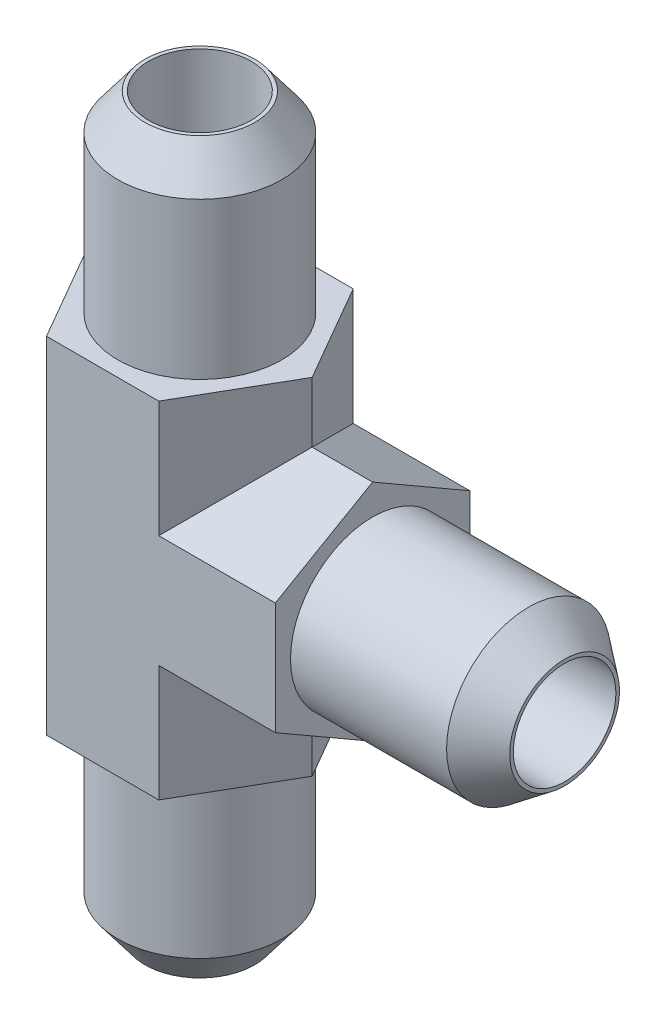
ISO-10303-21;
HEADER;
FILE_DESCRIPTION(('STEP AP214'),'2;1');
FILE_NAME('part.step','',(''),(''),'','','');
FILE_SCHEMA(('AUTOMOTIVE_DESIGN { 1 0 10303 214 1 1 1 1 }'));
ENDSEC;
DATA;
#1=APPLICATION_CONTEXT('core data for automotive mechanical design processes');
#2=APPLICATION_PROTOCOL_DEFINITION('international standard','automotive_design',2000,#1);
#3=PRODUCT_CONTEXT('',#1,'mechanical');
#4=PRODUCT('Part','Part','',(#3));
#5=PRODUCT_RELATED_PRODUCT_CATEGORY('part','',(#4));
#6=PRODUCT_DEFINITION_FORMATION('','',#4);
#7=PRODUCT_DEFINITION_CONTEXT('part definition',#1,'design');
#8=PRODUCT_DEFINITION('design','',#6,#7);
#9=PRODUCT_DEFINITION_SHAPE('','',#8);
#10=(LENGTH_UNIT() NAMED_UNIT(*) SI_UNIT(.MILLI.,.METRE.));
#11=(NAMED_UNIT(*) PLANE_ANGLE_UNIT() SI_UNIT($,.RADIAN.));
#12=(NAMED_UNIT(*) SI_UNIT($,.STERADIAN.) SOLID_ANGLE_UNIT());
#13=UNCERTAINTY_MEASURE_WITH_UNIT(LENGTH_MEASURE(1.E-05),#10,'distance_accuracy_value','');
#14=(GEOMETRIC_REPRESENTATION_CONTEXT(3) GLOBAL_UNCERTAINTY_ASSIGNED_CONTEXT((#13)) GLOBAL_UNIT_ASSIGNED_CONTEXT((#10,
#11,#12)) REPRESENTATION_CONTEXT('',''));
#15=CARTESIAN_POINT('',(0.,0.,0.));
#16=DIRECTION('',(0.,0.,1.));
#17=DIRECTION('',(1.,0.,0.));
#18=AXIS2_PLACEMENT_3D('',#15,#16,#17);
#19=CARTESIAN_POINT('',(0.,-26.8224,0.));
#20=DIRECTION('',(0.,1.,0.));
#21=DIRECTION('',(0.,0.,1.));
#22=AXIS2_PLACEMENT_3D('',#19,#20,#21);
#23=CYLINDRICAL_SURFACE('',#22,6.0325);
#24=CARTESIAN_POINT('',(0.,-12.7,0.));
#25=DIRECTION('',(0.,-1.,0.));
#26=DIRECTION('',(0.,0.,-1.));
#27=AXIS2_PLACEMENT_3D('',#24,#25,#26);
#28=CIRCLE('',#27,6.0325);
#29=CARTESIAN_POINT('',(0.,-12.7,-6.0325));
#30=VERTEX_POINT('',#29);
#31=EDGE_CURVE('E11',#30,#30,#28,.T.);
#32=ORIENTED_EDGE('',*,*,#31,.T.);
#33=EDGE_LOOP('',(#32));
#34=FACE_BOUND('',#33,.T.);
#35=CARTESIAN_POINT('',(0.,-24.1764053301711,0.));
#36=DIRECTION('',(0.,1.,0.));
#37=DIRECTION('',(0.,0.,1.));
#38=AXIS2_PLACEMENT_3D('',#35,#36,#37);
#39=CIRCLE('',#38,6.0325);
#40=CARTESIAN_POINT('',(0.,-24.1764053301711,6.0325));
#41=VERTEX_POINT('',#40);
#42=EDGE_CURVE('E160',#41,#41,#39,.F.);
#43=ORIENTED_EDGE('',*,*,#42,.F.);
#44=EDGE_LOOP('',(#43));
#45=FACE_BOUND('',#44,.T.);
#46=ADVANCED_FACE('F36',(#34,#45),#23,.T.);
#47=CARTESIAN_POINT('',(26.8224,0.,0.));
#48=DIRECTION('',(-1.,0.,0.));
#49=DIRECTION('',(0.,0.,1.));
#50=AXIS2_PLACEMENT_3D('',#47,#48,#49);
#51=CYLINDRICAL_SURFACE('',#50,6.0325);
#52=CARTESIAN_POINT('',(12.7,0.,0.));
#53=DIRECTION('',(1.,0.,0.));
#54=DIRECTION('',(0.,0.,-1.));
#55=AXIS2_PLACEMENT_3D('',#52,#53,#54);
#56=CIRCLE('',#55,6.0325);
#57=CARTESIAN_POINT('',(12.7,0.,-6.0325));
#58=VERTEX_POINT('',#57);
#59=EDGE_CURVE('E45',#58,#58,#56,.T.);
#60=ORIENTED_EDGE('',*,*,#59,.T.);
#61=EDGE_LOOP('',(#60));
#62=FACE_BOUND('',#61,.T.);
#63=CARTESIAN_POINT('',(24.1764053301711,0.,0.));
#64=DIRECTION('',(-1.,0.,0.));
#65=DIRECTION('',(0.,0.,1.));
#66=AXIS2_PLACEMENT_3D('',#63,#64,#65);
#67=CIRCLE('',#66,6.0325);
#68=CARTESIAN_POINT('',(24.1764053301711,0.,6.0325));
#69=VERTEX_POINT('',#68);
#70=EDGE_CURVE('E166',#69,#69,#67,.F.);
#71=ORIENTED_EDGE('',*,*,#70,.F.);
#72=EDGE_LOOP('',(#71));
#73=FACE_BOUND('',#72,.T.);
#74=ADVANCED_FACE('F314',(#62,#73),#51,.T.);
#75=CARTESIAN_POINT('',(4.12811215973278,12.7,7.15009999999998));
#76=DIRECTION('',(-0.866025403784442,0.,-0.499999999999995));
#77=DIRECTION('',(-0.499999999999995,0.,0.866025403784442));
#78=AXIS2_PLACEMENT_3D('',#75,#76,#77);
#79=PLANE('',#78);
#80=DIRECTION('',(-0.447213595499953,-0.447213595499959,0.774596669241486));
#81=VECTOR('',#80,1.);
#82=CARTESIAN_POINT('',(5.84248972778622,5.8424897277862,4.18071094877502));
#83=LINE('',#82,#81);
#84=CARTESIAN_POINT('',(8.25622431946552,8.25622431946547,0.));
#85=VERTEX_POINT('',#84);
#86=CARTESIAN_POINT('',(4.12811215973278,4.12811215973273,7.15009999999998));
#87=VERTEX_POINT('',#86);
#88=EDGE_CURVE('E40',#85,#87,#83,.T.);
#89=ORIENTED_EDGE('',*,*,#88,.F.);
#90=DIRECTION('',(0.,-1.,0.));
#91=VECTOR('',#90,1.);
#92=CARTESIAN_POINT('',(8.25622431946549,12.7,0.));
#93=LINE('',#92,#91);
#94=CARTESIAN_POINT('',(8.25622431946549,12.7,0.));
#95=VERTEX_POINT('',#94);
#96=EDGE_CURVE('E239',#95,#85,#93,.T.);
#97=ORIENTED_EDGE('',*,*,#96,.F.);
#98=DIRECTION('',(0.499999999999995,0.,-0.866025403784442));
#99=VECTOR('',#98,1.);
#100=CARTESIAN_POINT('',(4.12811215973278,12.7,7.15009999999998));
#101=LINE('',#100,#99);
#102=CARTESIAN_POINT('',(4.12811215973278,12.7,7.15009999999998));
#103=VERTEX_POINT('',#102);
#104=EDGE_CURVE('E211',#103,#95,#101,.T.);
#105=ORIENTED_EDGE('',*,*,#104,.F.);
#106=DIRECTION('',(0.,-1.,0.));
#107=VECTOR('',#106,1.);
#108=CARTESIAN_POINT('',(4.12811215973278,12.7,7.15009999999998));
#109=LINE('',#108,#107);
#110=EDGE_CURVE('E243',#103,#87,#109,.T.);
#111=ORIENTED_EDGE('',*,*,#110,.T.);
#112=EDGE_LOOP('',(#89,#97,#105,#111));
#113=FACE_BOUND('',#112,.T.);
#114=ADVANCED_FACE('F270',(#113),#79,.F.);
#115=DIRECTION('',(0.447213595499953,-0.447213595499959,-0.774596669241485));
#116=VECTOR('',#115,1.);
#117=CARTESIAN_POINT('',(0.762489727786258,-0.762489727786166,12.979529051225));
#118=LINE('',#117,#116);
#119=CARTESIAN_POINT('',(4.12811215973278,-4.12811215973273,7.15009999999998));
#120=VERTEX_POINT('',#119);
#121=CARTESIAN_POINT('',(8.25622431946552,-8.25622431946546,0.));
#122=VERTEX_POINT('',#121);
#123=EDGE_CURVE('E251',#120,#122,#118,.T.);
#124=ORIENTED_EDGE('',*,*,#123,.F.);
#125=CARTESIAN_POINT('',(4.12811215973278,-12.7,7.15009999999998));
#126=VERTEX_POINT('',#125);
#127=EDGE_CURVE('E242',#120,#126,#109,.T.);
#128=ORIENTED_EDGE('',*,*,#127,.T.);
#129=DIRECTION('',(0.499999999999995,0.,-0.866025403784442));
#130=VECTOR('',#129,1.);
#131=CARTESIAN_POINT('',(4.12811215973278,-12.7,7.15009999999998));
#132=LINE('',#131,#130);
#133=CARTESIAN_POINT('',(8.25622431946549,-12.7,0.));
#134=VERTEX_POINT('',#133);
#135=EDGE_CURVE('E225',#126,#134,#132,.T.);
#136=ORIENTED_EDGE('',*,*,#135,.T.);
#137=EDGE_CURVE('E238',#122,#134,#93,.T.);
#138=ORIENTED_EDGE('',*,*,#137,.F.);
#139=EDGE_LOOP('',(#124,#128,#136,#138));
#140=FACE_BOUND('',#139,.T.);
#141=ADVANCED_FACE('F286',(#140),#79,.F.);
#142=CARTESIAN_POINT('',(8.25622431946549,12.7,0.));
#143=DIRECTION('',(-0.866025403784435,0.,0.500000000000007));
#144=DIRECTION('',(0.500000000000007,0.,0.866025403784435));
#145=AXIS2_PLACEMENT_3D('',#142,#143,#144);
#146=PLANE('',#145);
#147=DIRECTION('',(0.447213595499965,0.447213595499956,0.77459666924148));
#148=VECTOR('',#147,1.);
#149=CARTESIAN_POINT('',(9.14497945557241,9.14497945557234,1.5393690512249));
#150=LINE('',#149,#148);
#151=CARTESIAN_POINT('',(4.12811215973268,4.12811215973274,-7.15009999999998));
#152=VERTEX_POINT('',#151);
#153=EDGE_CURVE('E200',#152,#85,#150,.T.);
#154=ORIENTED_EDGE('',*,*,#153,.F.);
#155=DIRECTION('',(0.,-1.,0.));
#156=VECTOR('',#155,1.);
#157=CARTESIAN_POINT('',(4.12811215973268,12.7,-7.15010000000004));
#158=LINE('',#157,#156);
#159=CARTESIAN_POINT('',(4.12811215973268,12.7,-7.15010000000004));
#160=VERTEX_POINT('',#159);
#161=EDGE_CURVE('E235',#160,#152,#158,.T.);
#162=ORIENTED_EDGE('',*,*,#161,.F.);
#163=DIRECTION('',(-0.500000000000007,0.,-0.866025403784435));
#164=VECTOR('',#163,1.);
#165=CARTESIAN_POINT('',(8.25622431946549,12.7,0.));
#166=LINE('',#165,#164);
#167=EDGE_CURVE('E213',#95,#160,#166,.T.);
#168=ORIENTED_EDGE('',*,*,#167,.F.);
#169=ORIENTED_EDGE('',*,*,#96,.T.);
#170=EDGE_LOOP('',(#154,#162,#168,#169));
#171=FACE_BOUND('',#170,.T.);
#172=ADVANCED_FACE('F298',(#171),#146,.F.);
#173=DIRECTION('',(-0.447213595499965,0.447213595499956,-0.774596669241481));
#174=VECTOR('',#173,1.);
#175=CARTESIAN_POINT('',(4.06497945557236,-4.06497945557238,-7.25944905122493));
#176=LINE('',#175,#174);
#177=CARTESIAN_POINT('',(4.12811215973268,-4.12811215973271,-7.15010000000004));
#178=VERTEX_POINT('',#177);
#179=EDGE_CURVE('E198',#122,#178,#176,.T.);
#180=ORIENTED_EDGE('',*,*,#179,.F.);
#181=ORIENTED_EDGE('',*,*,#137,.T.);
#182=DIRECTION('',(-0.500000000000007,0.,-0.866025403784435));
#183=VECTOR('',#182,1.);
#184=CARTESIAN_POINT('',(8.25622431946549,-12.7,0.));
#185=LINE('',#184,#183);
#186=CARTESIAN_POINT('',(4.12811215973268,-12.7,-7.15010000000004));
#187=VERTEX_POINT('',#186);
#188=EDGE_CURVE('E228',#134,#187,#185,.T.);
#189=ORIENTED_EDGE('',*,*,#188,.T.);
#190=EDGE_CURVE('E234',#178,#187,#158,.T.);
#191=ORIENTED_EDGE('',*,*,#190,.F.);
#192=EDGE_LOOP('',(#180,#181,#189,#191));
#193=FACE_BOUND('',#192,.T.);
#194=ADVANCED_FACE('F312',(#193),#146,.F.);
#195=CARTESIAN_POINT('',(-4.12811215973283,12.7,-7.15009999999995));
#196=DIRECTION('',(0.866025403784442,0.,0.499999999999995));
#197=DIRECTION('',(0.499999999999995,0.,-0.866025403784442));
#198=AXIS2_PLACEMENT_3D('',#195,#196,#197);
#199=PLANE('',#198);
#200=DIRECTION('',(-0.499999999999995,0.,0.866025403784442));
#201=VECTOR('',#200,1.);
#202=CARTESIAN_POINT('',(-4.12811215973283,-12.7,-7.15009999999995));
#203=LINE('',#202,#201);
#204=CARTESIAN_POINT('',(-4.12811215973283,-12.7,-7.15009999999995));
#205=VERTEX_POINT('',#204);
#206=CARTESIAN_POINT('',(-8.25622431946549,-12.7,0.));
#207=VERTEX_POINT('',#206);
#208=EDGE_CURVE('E202',#205,#207,#203,.T.);
#209=ORIENTED_EDGE('',*,*,#208,.T.);
#210=DIRECTION('',(0.,-1.,0.));
#211=VECTOR('',#210,1.);
#212=CARTESIAN_POINT('',(-8.25622431946549,12.7,0.));
#213=LINE('',#212,#211);
#214=CARTESIAN_POINT('',(-8.25622431946549,12.7,0.));
#215=VERTEX_POINT('',#214);
#216=EDGE_CURVE('E249',#215,#207,#213,.T.);
#217=ORIENTED_EDGE('',*,*,#216,.F.);
#218=DIRECTION('',(-0.499999999999995,0.,0.866025403784442));
#219=VECTOR('',#218,1.);
#220=CARTESIAN_POINT('',(-4.12811215973283,12.7,-7.15009999999995));
#221=LINE('',#220,#219);
#222=CARTESIAN_POINT('',(-4.12811215973283,12.7,-7.15009999999995));
#223=VERTEX_POINT('',#222);
#224=EDGE_CURVE('E203',#223,#215,#221,.T.);
#225=ORIENTED_EDGE('',*,*,#224,.F.);
#226=DIRECTION('',(0.,-1.,0.));
#227=VECTOR('',#226,1.);
#228=CARTESIAN_POINT('',(-4.12811215973283,12.7,-7.15009999999995));
#229=LINE('',#228,#227);
#230=EDGE_CURVE('E217',#223,#205,#229,.T.);
#231=ORIENTED_EDGE('',*,*,#230,.T.);
#232=EDGE_LOOP('',(#209,#217,#225,#231));
#233=FACE_BOUND('',#232,.T.);
#234=ADVANCED_FACE('F38',(#233),#199,.F.);
#235=CARTESIAN_POINT('',(-8.25622431946549,12.7,0.));
#236=DIRECTION('',(0.866025403784438,0.,-0.500000000000001));
#237=DIRECTION('',(-0.500000000000001,0.,-0.866025403784438));
#238=AXIS2_PLACEMENT_3D('',#235,#236,#237);
#239=PLANE('',#238);
#240=DIRECTION('',(0.500000000000001,0.,0.866025403784438));
#241=VECTOR('',#240,1.);
#242=CARTESIAN_POINT('',(-8.25622431946549,-12.7,0.));
#243=LINE('',#242,#241);
#244=CARTESIAN_POINT('',(-4.12811215973273,-12.7,7.15010000000001));
#245=VERTEX_POINT('',#244);
#246=EDGE_CURVE('E220',#207,#245,#243,.T.);
#247=ORIENTED_EDGE('',*,*,#246,.T.);
#248=DIRECTION('',(0.,-1.,0.));
#249=VECTOR('',#248,1.);
#250=CARTESIAN_POINT('',(-4.12811215973273,12.7,7.15010000000001));
#251=LINE('',#250,#249);
#252=CARTESIAN_POINT('',(-4.12811215973273,12.7,7.15010000000001));
#253=VERTEX_POINT('',#252);
#254=EDGE_CURVE('E246',#253,#245,#251,.T.);
#255=ORIENTED_EDGE('',*,*,#254,.F.);
#256=DIRECTION('',(0.500000000000001,0.,0.866025403784438));
#257=VECTOR('',#256,1.);
#258=CARTESIAN_POINT('',(-8.25622431946549,12.7,0.));
#259=LINE('',#258,#257);
#260=EDGE_CURVE('E206',#215,#253,#259,.T.);
#261=ORIENTED_EDGE('',*,*,#260,.F.);
#262=ORIENTED_EDGE('',*,*,#216,.T.);
#263=EDGE_LOOP('',(#247,#255,#261,#262));
#264=FACE_BOUND('',#263,.T.);
#265=ADVANCED_FACE('F305',(#264),#239,.F.);
#266=CARTESIAN_POINT('',(-4.12811215973273,12.7,7.15010000000001));
#267=DIRECTION('',(0.,0.,-1.));
#268=DIRECTION('',(-1.,0.,0.));
#269=AXIS2_PLACEMENT_3D('',#266,#267,#268);
#270=PLANE('',#269);
#271=ORIENTED_EDGE('',*,*,#127,.F.);
#272=DIRECTION('',(-1.,0.,0.));
#273=VECTOR('',#272,1.);
#274=CARTESIAN_POINT('',(12.7,-4.12811215973273,7.15009999999998));
#275=LINE('',#274,#273);
#276=CARTESIAN_POINT('',(12.7,-4.12811215973273,7.15009999999998));
#277=VERTEX_POINT('',#276);
#278=EDGE_CURVE('E190',#277,#120,#275,.T.);
#279=ORIENTED_EDGE('',*,*,#278,.F.);
#280=DIRECTION('',(0.,-1.,0.));
#281=VECTOR('',#280,1.);
#282=CARTESIAN_POINT('',(12.7,4.12811215973273,7.15009999999998));
#283=LINE('',#282,#281);
#284=CARTESIAN_POINT('',(12.7,4.12811215973273,7.15009999999998));
#285=VERTEX_POINT('',#284);
#286=EDGE_CURVE('E176',#285,#277,#283,.T.);
#287=ORIENTED_EDGE('',*,*,#286,.F.);
#288=DIRECTION('',(-1.,0.,0.));
#289=VECTOR('',#288,1.);
#290=CARTESIAN_POINT('',(12.7,4.12811215973273,7.15009999999998));
#291=LINE('',#290,#289);
#292=EDGE_CURVE('E192',#285,#87,#291,.T.);
#293=ORIENTED_EDGE('',*,*,#292,.T.);
#294=ORIENTED_EDGE('',*,*,#110,.F.);
#295=DIRECTION('',(1.,0.,0.));
#296=VECTOR('',#295,1.);
#297=CARTESIAN_POINT('',(-4.12811215973273,12.7,7.15010000000001));
#298=LINE('',#297,#296);
#299=EDGE_CURVE('E209',#253,#103,#298,.T.);
#300=ORIENTED_EDGE('',*,*,#299,.F.);
#301=ORIENTED_EDGE('',*,*,#254,.T.);
#302=DIRECTION('',(1.,0.,0.));
#303=VECTOR('',#302,1.);
#304=CARTESIAN_POINT('',(-4.12811215973273,-12.7,7.15010000000001));
#305=LINE('',#304,#303);
#306=EDGE_CURVE('E222',#245,#126,#305,.T.);
#307=ORIENTED_EDGE('',*,*,#306,.T.);
#308=EDGE_LOOP('',(#271,#279,#287,#293,#294,#300,#301,#307));
#309=FACE_BOUND('',#308,.T.);
#310=ADVANCED_FACE('F266',(#309),#270,.F.);
#311=CARTESIAN_POINT('',(4.12811215973268,12.7,-7.15010000000004));
#312=DIRECTION('',(0.,0.,1.));
#313=DIRECTION('',(1.,0.,0.));
#314=AXIS2_PLACEMENT_3D('',#311,#312,#313);
#315=PLANE('',#314);
#316=ORIENTED_EDGE('',*,*,#161,.T.);
#317=DIRECTION('',(-1.,0.,0.));
#318=VECTOR('',#317,1.);
#319=CARTESIAN_POINT('',(12.7,4.12811215973274,-7.15009999999998));
#320=LINE('',#319,#318);
#321=CARTESIAN_POINT('',(12.7,4.12811215973274,-7.15009999999998));
#322=VERTEX_POINT('',#321);
#323=EDGE_CURVE('E184',#322,#152,#320,.T.);
#324=ORIENTED_EDGE('',*,*,#323,.F.);
#325=DIRECTION('',(0.,1.,0.));
#326=VECTOR('',#325,1.);
#327=CARTESIAN_POINT('',(12.7,-4.12811215973273,-7.15009999999998));
#328=LINE('',#327,#326);
#329=CARTESIAN_POINT('',(12.7,-4.12811215973273,-7.15009999999998));
#330=VERTEX_POINT('',#329);
#331=EDGE_CURVE('E182',#330,#322,#328,.T.);
#332=ORIENTED_EDGE('',*,*,#331,.F.);
#333=DIRECTION('',(-1.,0.,0.));
#334=VECTOR('',#333,1.);
#335=CARTESIAN_POINT('',(12.7,-4.12811215973273,-7.15009999999998));
#336=LINE('',#335,#334);
#337=EDGE_CURVE('E60',#330,#178,#336,.T.);
#338=ORIENTED_EDGE('',*,*,#337,.T.);
#339=ORIENTED_EDGE('',*,*,#190,.T.);
#340=DIRECTION('',(-1.,0.,0.));
#341=VECTOR('',#340,1.);
#342=CARTESIAN_POINT('',(4.12811215973268,-12.7,-7.15010000000004));
#343=LINE('',#342,#341);
#344=EDGE_CURVE('E207',#187,#205,#343,.T.);
#345=ORIENTED_EDGE('',*,*,#344,.T.);
#346=ORIENTED_EDGE('',*,*,#230,.F.);
#347=DIRECTION('',(-1.,0.,0.));
#348=VECTOR('',#347,1.);
#349=CARTESIAN_POINT('',(4.12811215973268,12.7,-7.15010000000004));
#350=LINE('',#349,#348);
#351=EDGE_CURVE('E215',#160,#223,#350,.T.);
#352=ORIENTED_EDGE('',*,*,#351,.F.);
#353=EDGE_LOOP('',(#316,#324,#332,#338,#339,#345,#346,#352));
#354=FACE_BOUND('',#353,.T.);
#355=ADVANCED_FACE('F300',(#354),#315,.F.);
#356=CARTESIAN_POINT('',(0.,12.7,0.));
#357=DIRECTION('',(0.,1.,0.));
#358=DIRECTION('',(0.,0.,1.));
#359=AXIS2_PLACEMENT_3D('',#356,#357,#358);
#360=PLANE('',#359);
#361=CARTESIAN_POINT('',(0.,12.7,0.));
#362=DIRECTION('',(0.,-1.,0.));
#363=DIRECTION('',(0.,0.,-1.));
#364=AXIS2_PLACEMENT_3D('',#361,#362,#363);
#365=CIRCLE('',#364,6.0325);
#366=CARTESIAN_POINT('',(0.,12.7,-6.0325));
#367=VERTEX_POINT('',#366);
#368=EDGE_CURVE('E154',#367,#367,#365,.T.);
#369=ORIENTED_EDGE('',*,*,#368,.T.);
#370=EDGE_LOOP('',(#369));
#371=FACE_BOUND('',#370,.T.);
#372=ORIENTED_EDGE('',*,*,#224,.T.);
#373=ORIENTED_EDGE('',*,*,#260,.T.);
#374=ORIENTED_EDGE('',*,*,#299,.T.);
#375=ORIENTED_EDGE('',*,*,#104,.T.);
#376=ORIENTED_EDGE('',*,*,#167,.T.);
#377=ORIENTED_EDGE('',*,*,#351,.T.);
#378=EDGE_LOOP('',(#372,#373,#374,#375,#376,#377));
#379=FACE_BOUND('',#378,.T.);
#380=ADVANCED_FACE('F273',(#371,#379),#360,.T.);
#381=CARTESIAN_POINT('',(0.,-12.7,0.));
#382=DIRECTION('',(0.,1.,0.));
#383=DIRECTION('',(0.,0.,1.));
#384=AXIS2_PLACEMENT_3D('',#381,#382,#383);
#385=PLANE('',#384);
#386=ORIENTED_EDGE('',*,*,#31,.F.);
#387=EDGE_LOOP('',(#386));
#388=FACE_BOUND('',#387,.T.);
#389=ORIENTED_EDGE('',*,*,#208,.F.);
#390=ORIENTED_EDGE('',*,*,#344,.F.);
#391=ORIENTED_EDGE('',*,*,#188,.F.);
#392=ORIENTED_EDGE('',*,*,#135,.F.);
#393=ORIENTED_EDGE('',*,*,#306,.F.);
#394=ORIENTED_EDGE('',*,*,#246,.F.);
#395=EDGE_LOOP('',(#389,#390,#391,#392,#393,#394));
#396=FACE_BOUND('',#395,.T.);
#397=ADVANCED_FACE('F281',(#388,#396),#385,.F.);
#398=CARTESIAN_POINT('',(12.7,8.25622431946547,0.));
#399=DIRECTION('',(0.,-0.866025403784439,-0.5));
#400=DIRECTION('',(0.,0.5,-0.866025403784439));
#401=AXIS2_PLACEMENT_3D('',#398,#399,#400);
#402=PLANE('',#401);
#403=DIRECTION('',(-1.,0.,0.));
#404=VECTOR('',#403,1.);
#405=CARTESIAN_POINT('',(12.7,8.25622431946547,0.));
#406=LINE('',#405,#404);
#407=CARTESIAN_POINT('',(12.7,8.25622431946547,0.));
#408=VERTEX_POINT('',#407);
#409=EDGE_CURVE('E195',#408,#85,#406,.T.);
#410=ORIENTED_EDGE('',*,*,#409,.T.);
#411=ORIENTED_EDGE('',*,*,#88,.T.);
#412=ORIENTED_EDGE('',*,*,#292,.F.);
#413=DIRECTION('',(0.,-0.5,0.866025403784439));
#414=VECTOR('',#413,1.);
#415=CARTESIAN_POINT('',(12.7,8.25622431946547,0.));
#416=LINE('',#415,#414);
#417=EDGE_CURVE('E174',#408,#285,#416,.T.);
#418=ORIENTED_EDGE('',*,*,#417,.F.);
#419=EDGE_LOOP('',(#410,#411,#412,#418));
#420=FACE_BOUND('',#419,.T.);
#421=ADVANCED_FACE('F258',(#420),#402,.F.);
#422=CARTESIAN_POINT('',(12.7,-4.12811215973273,7.15009999999998));
#423=DIRECTION('',(0.,0.866025403784439,-0.5));
#424=DIRECTION('',(0.,0.5,0.866025403784439));
#425=AXIS2_PLACEMENT_3D('',#422,#423,#424);
#426=PLANE('',#425);
#427=ORIENTED_EDGE('',*,*,#278,.T.);
#428=ORIENTED_EDGE('',*,*,#123,.T.);
#429=DIRECTION('',(-1.,0.,0.));
#430=VECTOR('',#429,1.);
#431=CARTESIAN_POINT('',(12.7,-8.25622431946546,0.));
#432=LINE('',#431,#430);
#433=CARTESIAN_POINT('',(12.7,-8.25622431946546,0.));
#434=VERTEX_POINT('',#433);
#435=EDGE_CURVE('E187',#434,#122,#432,.T.);
#436=ORIENTED_EDGE('',*,*,#435,.F.);
#437=DIRECTION('',(0.,-0.5,-0.866025403784439));
#438=VECTOR('',#437,1.);
#439=CARTESIAN_POINT('',(12.7,-4.12811215973273,7.15009999999998));
#440=LINE('',#439,#438);
#441=EDGE_CURVE('E178',#277,#434,#440,.T.);
#442=ORIENTED_EDGE('',*,*,#441,.F.);
#443=EDGE_LOOP('',(#427,#428,#436,#442));
#444=FACE_BOUND('',#443,.T.);
#445=ADVANCED_FACE('F288',(#444),#426,.F.);
#446=CARTESIAN_POINT('',(12.7,4.12811215973274,-7.15009999999998));
#447=DIRECTION('',(0.,-0.866025403784439,0.5));
#448=DIRECTION('',(0.,-0.5,-0.866025403784439));
#449=AXIS2_PLACEMENT_3D('',#446,#447,#448);
#450=PLANE('',#449);
#451=ORIENTED_EDGE('',*,*,#323,.T.);
#452=ORIENTED_EDGE('',*,*,#153,.T.);
#453=ORIENTED_EDGE('',*,*,#409,.F.);
#454=DIRECTION('',(0.,0.5,0.866025403784439));
#455=VECTOR('',#454,1.);
#456=CARTESIAN_POINT('',(12.7,4.12811215973274,-7.15009999999998));
#457=LINE('',#456,#455);
#458=EDGE_CURVE('E169',#322,#408,#457,.T.);
#459=ORIENTED_EDGE('',*,*,#458,.F.);
#460=EDGE_LOOP('',(#451,#452,#453,#459));
#461=FACE_BOUND('',#460,.T.);
#462=ADVANCED_FACE('F295',(#461),#450,.F.);
#463=CARTESIAN_POINT('',(12.7,-8.25622431946546,0.));
#464=DIRECTION('',(0.,0.866025403784439,0.5));
#465=DIRECTION('',(0.,-0.5,0.866025403784439));
#466=AXIS2_PLACEMENT_3D('',#463,#464,#465);
#467=PLANE('',#466);
#468=ORIENTED_EDGE('',*,*,#435,.T.);
#469=ORIENTED_EDGE('',*,*,#179,.T.);
#470=ORIENTED_EDGE('',*,*,#337,.F.);
#471=DIRECTION('',(0.,0.5,-0.866025403784439));
#472=VECTOR('',#471,1.);
#473=CARTESIAN_POINT('',(12.7,-8.25622431946546,0.));
#474=LINE('',#473,#472);
#475=EDGE_CURVE('E180',#434,#330,#474,.T.);
#476=ORIENTED_EDGE('',*,*,#475,.F.);
#477=EDGE_LOOP('',(#468,#469,#470,#476));
#478=FACE_BOUND('',#477,.T.);
#479=ADVANCED_FACE('F338',(#478),#467,.F.);
#480=CARTESIAN_POINT('',(12.7,0.,0.));
#481=DIRECTION('',(1.,0.,0.));
#482=DIRECTION('',(0.,0.,-1.));
#483=AXIS2_PLACEMENT_3D('',#480,#481,#482);
#484=PLANE('',#483);
#485=ORIENTED_EDGE('',*,*,#59,.F.);
#486=EDGE_LOOP('',(#485));
#487=FACE_BOUND('',#486,.T.);
#488=ORIENTED_EDGE('',*,*,#458,.T.);
#489=ORIENTED_EDGE('',*,*,#417,.T.);
#490=ORIENTED_EDGE('',*,*,#286,.T.);
#491=ORIENTED_EDGE('',*,*,#441,.T.);
#492=ORIENTED_EDGE('',*,*,#475,.T.);
#493=ORIENTED_EDGE('',*,*,#331,.T.);
#494=EDGE_LOOP('',(#488,#489,#490,#491,#492,#493));
#495=FACE_BOUND('',#494,.T.);
#496=ADVANCED_FACE('F291',(#487,#495),#484,.T.);
#497=CARTESIAN_POINT('',(26.8224,0.,0.));
#498=DIRECTION('',(-1.,0.,0.));
#499=DIRECTION('',(0.,0.,-1.));
#500=AXIS2_PLACEMENT_3D('',#497,#498,#499);
#501=CONICAL_SURFACE('',#500,4.0386,0.645771823237903);
#502=CARTESIAN_POINT('',(26.8224,0.,0.));
#503=DIRECTION('',(1.,0.,0.));
#504=DIRECTION('',(0.,0.,-1.));
#505=AXIS2_PLACEMENT_3D('',#502,#503,#504);
#506=CIRCLE('',#505,4.0386);
#507=CARTESIAN_POINT('',(26.8224,0.,-4.0386));
#508=VERTEX_POINT('',#507);
#509=EDGE_CURVE('E162',#508,#508,#506,.T.);
#510=ORIENTED_EDGE('',*,*,#509,.F.);
#511=EDGE_LOOP('',(#510));
#512=FACE_BOUND('',#511,.T.);
#513=ORIENTED_EDGE('',*,*,#70,.T.);
#514=EDGE_LOOP('',(#513));
#515=FACE_BOUND('',#514,.T.);
#516=ADVANCED_FACE('F327',(#512,#515),#501,.T.);
#517=CARTESIAN_POINT('',(26.8224,0.,0.));
#518=DIRECTION('',(1.,0.,0.));
#519=DIRECTION('',(0.,0.,-1.));
#520=AXIS2_PLACEMENT_3D('',#517,#518,#519);
#521=PLANE('',#520);
#522=CARTESIAN_POINT('',(26.8224,0.,0.));
#523=DIRECTION('',(1.,0.,0.));
#524=DIRECTION('',(0.,0.,-1.));
#525=AXIS2_PLACEMENT_3D('',#522,#523,#524);
#526=CIRCLE('',#525,3.7719);
#527=CARTESIAN_POINT('',(26.8224,0.,-3.7719));
#528=VERTEX_POINT('',#527);
#529=EDGE_CURVE('E137',#528,#528,#526,.T.);
#530=ORIENTED_EDGE('',*,*,#529,.F.);
#531=EDGE_LOOP('',(#530));
#532=FACE_BOUND('',#531,.T.);
#533=ORIENTED_EDGE('',*,*,#509,.T.);
#534=EDGE_LOOP('',(#533));
#535=FACE_BOUND('',#534,.T.);
#536=ADVANCED_FACE('F330',(#532,#535),#521,.T.);
#537=CARTESIAN_POINT('',(0.,-26.8224,0.));
#538=DIRECTION('',(0.,1.,0.));
#539=DIRECTION('',(0.,0.,-1.));
#540=AXIS2_PLACEMENT_3D('',#537,#538,#539);
#541=CONICAL_SURFACE('',#540,4.0386,0.645771823237903);
#542=CARTESIAN_POINT('',(0.,-26.8224,0.));
#543=DIRECTION('',(0.,-1.,0.));
#544=DIRECTION('',(0.,0.,-1.));
#545=AXIS2_PLACEMENT_3D('',#542,#543,#544);
#546=CIRCLE('',#545,4.0386);
#547=CARTESIAN_POINT('',(0.,-26.8224,-4.0386));
#548=VERTEX_POINT('',#547);
#549=EDGE_CURVE('E157',#548,#548,#546,.T.);
#550=ORIENTED_EDGE('',*,*,#549,.F.);
#551=EDGE_LOOP('',(#550));
#552=FACE_BOUND('',#551,.T.);
#553=ORIENTED_EDGE('',*,*,#42,.T.);
#554=EDGE_LOOP('',(#553));
#555=FACE_BOUND('',#554,.T.);
#556=ADVANCED_FACE('F333',(#552,#555),#541,.T.);
#557=CARTESIAN_POINT('',(0.,-26.8224,0.));
#558=DIRECTION('',(0.,-1.,0.));
#559=DIRECTION('',(0.,0.,-1.));
#560=AXIS2_PLACEMENT_3D('',#557,#558,#559);
#561=PLANE('',#560);
#562=CARTESIAN_POINT('',(0.,-26.8224,0.));
#563=DIRECTION('',(0.,-1.,0.));
#564=DIRECTION('',(0.,0.,-1.));
#565=AXIS2_PLACEMENT_3D('',#562,#563,#564);
#566=CIRCLE('',#565,3.7719);
#567=CARTESIAN_POINT('',(0.,-26.8224,-3.7719));
#568=VERTEX_POINT('',#567);
#569=EDGE_CURVE('E140',#568,#568,#566,.T.);
#570=ORIENTED_EDGE('',*,*,#569,.F.);
#571=EDGE_LOOP('',(#570));
#572=FACE_BOUND('',#571,.T.);
#573=ORIENTED_EDGE('',*,*,#549,.T.);
#574=EDGE_LOOP('',(#573));
#575=FACE_BOUND('',#574,.T.);
#576=ADVANCED_FACE('F325',(#572,#575),#561,.T.);
#577=CARTESIAN_POINT('',(0.,26.8224,0.));
#578=DIRECTION('',(0.,-1.,0.));
#579=DIRECTION('',(0.,0.,-1.));
#580=AXIS2_PLACEMENT_3D('',#577,#578,#579);
#581=CYLINDRICAL_SURFACE('',#580,6.0325);
#582=CARTESIAN_POINT('',(0.,24.1764053301711,0.));
#583=DIRECTION('',(0.,-1.,0.));
#584=DIRECTION('',(0.,0.,-1.));
#585=AXIS2_PLACEMENT_3D('',#582,#583,#584);
#586=CIRCLE('',#585,6.0325);
#587=CARTESIAN_POINT('',(0.,24.1764053301711,-6.0325));
#588=VERTEX_POINT('',#587);
#589=EDGE_CURVE('E151',#588,#588,#586,.F.);
#590=ORIENTED_EDGE('',*,*,#589,.F.);
#591=EDGE_LOOP('',(#590));
#592=FACE_BOUND('',#591,.T.);
#593=ORIENTED_EDGE('',*,*,#368,.F.);
#594=EDGE_LOOP('',(#593));
#595=FACE_BOUND('',#594,.T.);
#596=ADVANCED_FACE('F459',(#592,#595),#581,.T.);
#597=CARTESIAN_POINT('',(0.,26.8224,0.));
#598=DIRECTION('',(0.,-1.,0.));
#599=DIRECTION('',(0.,0.,-1.));
#600=AXIS2_PLACEMENT_3D('',#597,#598,#599);
#601=CONICAL_SURFACE('',#600,4.0386,0.645771823237903);
#602=ORIENTED_EDGE('',*,*,#589,.T.);
#603=EDGE_LOOP('',(#602));
#604=FACE_BOUND('',#603,.T.);
#605=CARTESIAN_POINT('',(0.,26.8224,0.));
#606=DIRECTION('',(0.,-1.,0.));
#607=DIRECTION('',(0.,0.,-1.));
#608=AXIS2_PLACEMENT_3D('',#605,#606,#607);
#609=CIRCLE('',#608,4.0386);
#610=CARTESIAN_POINT('',(0.,26.8224,-4.0386));
#611=VERTEX_POINT('',#610);
#612=EDGE_CURVE('E146',#611,#611,#609,.T.);
#613=ORIENTED_EDGE('',*,*,#612,.T.);
#614=EDGE_LOOP('',(#613));
#615=FACE_BOUND('',#614,.T.);
#616=ADVANCED_FACE('F480',(#604,#615),#601,.T.);
#617=CARTESIAN_POINT('',(0.,26.8224,0.));
#618=DIRECTION('',(0.,1.,0.));
#619=DIRECTION('',(0.,0.,-1.));
#620=AXIS2_PLACEMENT_3D('',#617,#618,#619);
#621=PLANE('',#620);
#622=CARTESIAN_POINT('',(0.,26.8224,0.));
#623=DIRECTION('',(0.,-1.,0.));
#624=DIRECTION('',(0.,0.,-1.));
#625=AXIS2_PLACEMENT_3D('',#622,#623,#624);
#626=CIRCLE('',#625,3.7719);
#627=CARTESIAN_POINT('',(0.,26.8224,-3.7719));
#628=VERTEX_POINT('',#627);
#629=EDGE_CURVE('E143',#628,#628,#626,.T.);
#630=ORIENTED_EDGE('',*,*,#629,.T.);
#631=EDGE_LOOP('',(#630));
#632=FACE_BOUND('',#631,.T.);
#633=ORIENTED_EDGE('',*,*,#612,.F.);
#634=EDGE_LOOP('',(#633));
#635=FACE_BOUND('',#634,.T.);
#636=ADVANCED_FACE('F484',(#632,#635),#621,.T.);
#637=CARTESIAN_POINT('',(0.,26.8224,0.));
#638=DIRECTION('',(0.,-1.,0.));
#639=DIRECTION('',(0.,0.,-1.));
#640=AXIS2_PLACEMENT_3D('',#637,#638,#639);
#641=CYLINDRICAL_SURFACE('',#640,3.7719);
#642=CARTESIAN_POINT('',(0.,0.,0.));
#643=DIRECTION('',(0.707106781186547,0.707106781186547,0.));
#644=DIRECTION('',(0.707106781186547,-0.707106781186547,0.));
#645=AXIS2_PLACEMENT_3D('',#642,#643,#644);
#646=ELLIPSE('',#645,5.33427213591508,3.7719);
#647=CARTESIAN_POINT('',(0.,0.,-3.7719));
#648=VERTEX_POINT('',#647);
#649=CARTESIAN_POINT('',(0.,0.,3.7719));
#650=VERTEX_POINT('',#649);
#651=EDGE_CURVE('E131',#648,#650,#646,.F.);
#652=ORIENTED_EDGE('',*,*,#651,.F.);
#653=CARTESIAN_POINT('',(0.,0.,0.));
#654=DIRECTION('',(0.707106781186547,-0.707106781186547,0.));
#655=DIRECTION('',(0.707106781186547,0.707106781186547,0.));
#656=AXIS2_PLACEMENT_3D('',#653,#654,#655);
#657=ELLIPSE('',#656,5.33427213591508,3.7719);
#658=EDGE_CURVE('E52',#650,#648,#657,.F.);
#659=ORIENTED_EDGE('',*,*,#658,.F.);
#660=EDGE_LOOP('',(#652,#659));
#661=FACE_BOUND('',#660,.T.);
#662=ORIENTED_EDGE('',*,*,#629,.F.);
#663=EDGE_LOOP('',(#662));
#664=FACE_BOUND('',#663,.T.);
#665=ORIENTED_EDGE('',*,*,#569,.T.);
#666=EDGE_LOOP('',(#665));
#667=FACE_BOUND('',#666,.T.);
#668=ADVANCED_FACE('F135',(#661,#664,#667),#641,.F.);
#669=CARTESIAN_POINT('',(-8.25722431946549,0.,0.));
#670=DIRECTION('',(1.,0.,0.));
#671=DIRECTION('',(0.,0.,-1.));
#672=AXIS2_PLACEMENT_3D('',#669,#670,#671);
#673=CYLINDRICAL_SURFACE('',#672,3.7719);
#674=ORIENTED_EDGE('',*,*,#529,.T.);
#675=EDGE_LOOP('',(#674));
#676=FACE_BOUND('',#675,.T.);
#677=ORIENTED_EDGE('',*,*,#658,.T.);
#678=ORIENTED_EDGE('',*,*,#651,.T.);
#679=EDGE_LOOP('',(#677,#678));
#680=FACE_BOUND('',#679,.T.);
#681=ADVANCED_FACE('F132',(#676,#680),#673,.F.);
#682=CLOSED_SHELL('',(#46,#74,#114,#141,#172,#194,#234,#265,#310,#355,#380,#397,#421,#445,#462,
#479,#496,#516,#536,#556,#576,#596,#616,#636,#668,#681));
#683=MANIFOLD_SOLID_BREP('B2',#682);
#684=ADVANCED_BREP_SHAPE_REPRESENTATION('',(#18,#683),#14);
#685=SHAPE_DEFINITION_REPRESENTATION(#9,#684);
ENDSEC;
END-ISO-10303-21;
